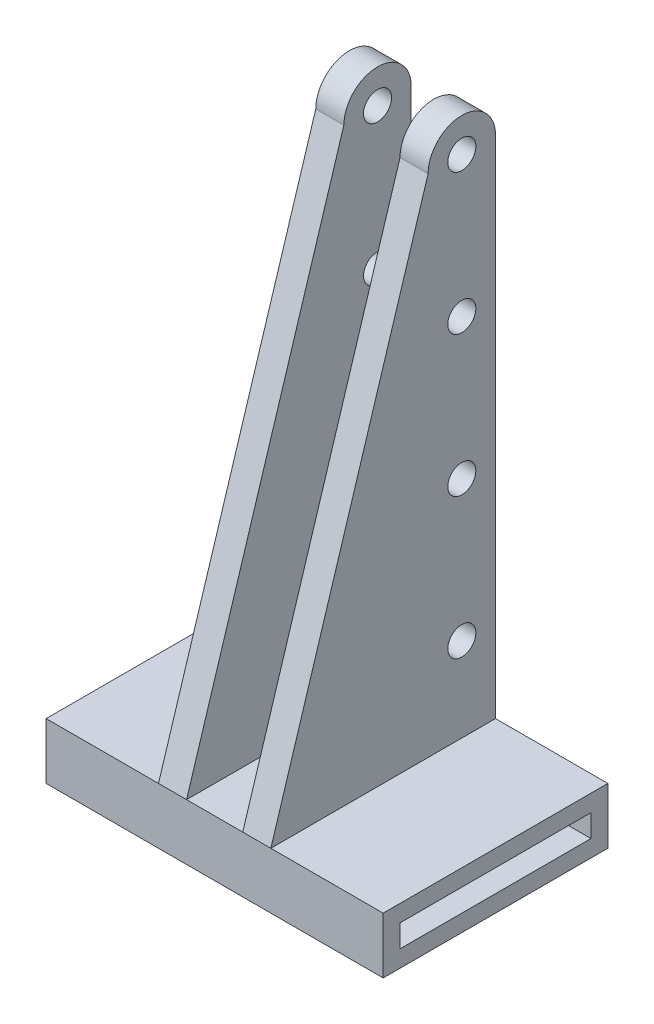
ISO-10303-21;
HEADER;
FILE_DESCRIPTION(('STEP AP214'),'2;1');
FILE_NAME('part.step','',(''),(''),'','','');
FILE_SCHEMA(('AUTOMOTIVE_DESIGN { 1 0 10303 214 1 1 1 1 }'));
ENDSEC;
DATA;
#1=APPLICATION_CONTEXT('core data for automotive mechanical design processes');
#2=APPLICATION_PROTOCOL_DEFINITION('international standard','automotive_design',2000,#1);
#3=PRODUCT_CONTEXT('',#1,'mechanical');
#4=PRODUCT('Part','Part','',(#3));
#5=PRODUCT_RELATED_PRODUCT_CATEGORY('part','',(#4));
#6=PRODUCT_DEFINITION_FORMATION('','',#4);
#7=PRODUCT_DEFINITION_CONTEXT('part definition',#1,'design');
#8=PRODUCT_DEFINITION('design','',#6,#7);
#9=PRODUCT_DEFINITION_SHAPE('','',#8);
#10=(LENGTH_UNIT() NAMED_UNIT(*) SI_UNIT(.MILLI.,.METRE.));
#11=(NAMED_UNIT(*) PLANE_ANGLE_UNIT() SI_UNIT($,.RADIAN.));
#12=(NAMED_UNIT(*) SI_UNIT($,.STERADIAN.) SOLID_ANGLE_UNIT());
#13=UNCERTAINTY_MEASURE_WITH_UNIT(LENGTH_MEASURE(1.E-05),#10,'distance_accuracy_value','');
#14=(GEOMETRIC_REPRESENTATION_CONTEXT(3) GLOBAL_UNCERTAINTY_ASSIGNED_CONTEXT((#13)) GLOBAL_UNIT_ASSIGNED_CONTEXT((#10,
#11,#12)) REPRESENTATION_CONTEXT('',''));
#15=CARTESIAN_POINT('',(0.,0.,0.));
#16=DIRECTION('',(0.,0.,1.));
#17=DIRECTION('',(1.,0.,0.));
#18=AXIS2_PLACEMENT_3D('',#15,#16,#17);
#19=CARTESIAN_POINT('',(0.,10.,0.));
#20=DIRECTION('',(0.,1.,0.));
#21=DIRECTION('',(0.,0.,1.));
#22=AXIS2_PLACEMENT_3D('',#19,#20,#21);
#23=PLANE('',#22);
#24=DIRECTION('',(1.,0.,0.));
#25=VECTOR('',#24,1.);
#26=CARTESIAN_POINT('',(-30.,10.,20.));
#27=LINE('',#26,#25);
#28=CARTESIAN_POINT('',(-30.,10.,20.));
#29=VERTEX_POINT('',#28);
#30=CARTESIAN_POINT('',(-10.,10.,20.));
#31=VERTEX_POINT('',#30);
#32=EDGE_CURVE('E362',#29,#31,#27,.T.);
#33=ORIENTED_EDGE('',*,*,#32,.T.);
#34=DIRECTION('',(0.,0.,1.));
#35=VECTOR('',#34,1.);
#36=CARTESIAN_POINT('',(-10.,10.,0.));
#37=LINE('',#36,#35);
#38=CARTESIAN_POINT('',(-10.,10.,-20.));
#39=VERTEX_POINT('',#38);
#40=EDGE_CURVE('E229',#39,#31,#37,.T.);
#41=ORIENTED_EDGE('',*,*,#40,.F.);
#42=DIRECTION('',(-1.,0.,0.));
#43=VECTOR('',#42,1.);
#44=CARTESIAN_POINT('',(-30.,10.,-20.));
#45=LINE('',#44,#43);
#46=CARTESIAN_POINT('',(-30.,10.,-20.));
#47=VERTEX_POINT('',#46);
#48=EDGE_CURVE('E351',#39,#47,#45,.T.);
#49=ORIENTED_EDGE('',*,*,#48,.T.);
#50=DIRECTION('',(0.,0.,1.));
#51=VECTOR('',#50,1.);
#52=CARTESIAN_POINT('',(-30.,10.,-20.));
#53=LINE('',#52,#51);
#54=EDGE_CURVE('E357',#47,#29,#53,.T.);
#55=ORIENTED_EDGE('',*,*,#54,.T.);
#56=EDGE_LOOP('',(#33,#41,#49,#55));
#57=FACE_BOUND('',#56,.T.);
#58=ADVANCED_FACE('F38',(#57),#23,.T.);
#59=CARTESIAN_POINT('',(30.,10.,-20.));
#60=VERTEX_POINT('',#59);
#61=CARTESIAN_POINT('',(10.,10.,-20.));
#62=VERTEX_POINT('',#61);
#63=EDGE_CURVE('E353',#60,#62,#45,.T.);
#64=ORIENTED_EDGE('',*,*,#63,.T.);
#65=DIRECTION('',(0.,0.,1.));
#66=VECTOR('',#65,1.);
#67=CARTESIAN_POINT('',(10.,10.,0.));
#68=LINE('',#67,#66);
#69=CARTESIAN_POINT('',(10.,10.,20.));
#70=VERTEX_POINT('',#69);
#71=EDGE_CURVE('E301',#62,#70,#68,.T.);
#72=ORIENTED_EDGE('',*,*,#71,.T.);
#73=CARTESIAN_POINT('',(30.,10.,20.));
#74=VERTEX_POINT('',#73);
#75=EDGE_CURVE('E361',#70,#74,#27,.T.);
#76=ORIENTED_EDGE('',*,*,#75,.T.);
#77=DIRECTION('',(0.,0.,-1.));
#78=VECTOR('',#77,1.);
#79=CARTESIAN_POINT('',(30.,10.,-20.));
#80=LINE('',#79,#78);
#81=EDGE_CURVE('E347',#74,#60,#80,.T.);
#82=ORIENTED_EDGE('',*,*,#81,.T.);
#83=EDGE_LOOP('',(#64,#72,#76,#82));
#84=FACE_BOUND('',#83,.T.);
#85=ADVANCED_FACE('F407',(#84),#23,.T.);
#86=CARTESIAN_POINT('',(30.,10.,-20.));
#87=DIRECTION('',(-1.,0.,0.));
#88=DIRECTION('',(0.,0.,1.));
#89=AXIS2_PLACEMENT_3D('',#86,#87,#88);
#90=PLANE('',#89);
#91=DIRECTION('',(0.,0.,-1.));
#92=VECTOR('',#91,1.);
#93=CARTESIAN_POINT('',(30.,7.,17.));
#94=LINE('',#93,#92);
#95=CARTESIAN_POINT('',(30.,7.,17.));
#96=VERTEX_POINT('',#95);
#97=CARTESIAN_POINT('',(30.,7.,-17.));
#98=VERTEX_POINT('',#97);
#99=EDGE_CURVE('E161',#96,#98,#94,.T.);
#100=ORIENTED_EDGE('',*,*,#99,.T.);
#101=DIRECTION('',(0.,-1.,0.));
#102=VECTOR('',#101,1.);
#103=CARTESIAN_POINT('',(30.,7.,-17.));
#104=LINE('',#103,#102);
#105=CARTESIAN_POINT('',(30.,3.,-17.));
#106=VERTEX_POINT('',#105);
#107=EDGE_CURVE('E154',#98,#106,#104,.T.);
#108=ORIENTED_EDGE('',*,*,#107,.T.);
#109=DIRECTION('',(0.,0.,1.));
#110=VECTOR('',#109,1.);
#111=CARTESIAN_POINT('',(30.,3.,-17.));
#112=LINE('',#111,#110);
#113=CARTESIAN_POINT('',(30.,3.,17.));
#114=VERTEX_POINT('',#113);
#115=EDGE_CURVE('E164',#106,#114,#112,.T.);
#116=ORIENTED_EDGE('',*,*,#115,.T.);
#117=DIRECTION('',(0.,1.,0.));
#118=VECTOR('',#117,1.);
#119=CARTESIAN_POINT('',(30.,3.,17.));
#120=LINE('',#119,#118);
#121=EDGE_CURVE('E54',#114,#96,#120,.T.);
#122=ORIENTED_EDGE('',*,*,#121,.T.);
#123=EDGE_LOOP('',(#100,#108,#116,#122));
#124=FACE_BOUND('',#123,.T.);
#125=DIRECTION('',(0.,0.,-1.));
#126=VECTOR('',#125,1.);
#127=CARTESIAN_POINT('',(30.,0.,-20.));
#128=LINE('',#127,#126);
#129=CARTESIAN_POINT('',(30.,0.,20.));
#130=VERTEX_POINT('',#129);
#131=CARTESIAN_POINT('',(30.,0.,-20.));
#132=VERTEX_POINT('',#131);
#133=EDGE_CURVE('E346',#130,#132,#128,.T.);
#134=ORIENTED_EDGE('',*,*,#133,.T.);
#135=DIRECTION('',(0.,-1.,0.));
#136=VECTOR('',#135,1.);
#137=CARTESIAN_POINT('',(30.,10.,-20.));
#138=LINE('',#137,#136);
#139=EDGE_CURVE('E11',#60,#132,#138,.T.);
#140=ORIENTED_EDGE('',*,*,#139,.F.);
#141=ORIENTED_EDGE('',*,*,#81,.F.);
#142=DIRECTION('',(0.,-1.,0.));
#143=VECTOR('',#142,1.);
#144=CARTESIAN_POINT('',(30.,10.,20.));
#145=LINE('',#144,#143);
#146=EDGE_CURVE('E366',#74,#130,#145,.T.);
#147=ORIENTED_EDGE('',*,*,#146,.T.);
#148=EDGE_LOOP('',(#134,#140,#141,#147));
#149=FACE_BOUND('',#148,.T.);
#150=ADVANCED_FACE('F40',(#124,#149),#90,.F.);
#151=CARTESIAN_POINT('',(-30.,10.,-20.));
#152=DIRECTION('',(0.,0.,1.));
#153=DIRECTION('',(1.,0.,0.));
#154=AXIS2_PLACEMENT_3D('',#151,#152,#153);
#155=PLANE('',#154);
#156=DIRECTION('',(-1.,0.,0.));
#157=VECTOR('',#156,1.);
#158=CARTESIAN_POINT('',(-30.,0.,-20.));
#159=LINE('',#158,#157);
#160=CARTESIAN_POINT('',(-30.,0.,-20.));
#161=VERTEX_POINT('',#160);
#162=EDGE_CURVE('E371',#132,#161,#159,.T.);
#163=ORIENTED_EDGE('',*,*,#162,.T.);
#164=DIRECTION('',(0.,-1.,0.));
#165=VECTOR('',#164,1.);
#166=CARTESIAN_POINT('',(-30.,10.,-20.));
#167=LINE('',#166,#165);
#168=EDGE_CURVE('E47',#47,#161,#167,.T.);
#169=ORIENTED_EDGE('',*,*,#168,.F.);
#170=ORIENTED_EDGE('',*,*,#48,.F.);
#171=DIRECTION('',(0.,1.,0.));
#172=VECTOR('',#171,1.);
#173=CARTESIAN_POINT('',(-10.,0.,-20.));
#174=LINE('',#173,#172);
#175=CARTESIAN_POINT('',(-10.,100.,-20.));
#176=VERTEX_POINT('',#175);
#177=EDGE_CURVE('E217',#39,#176,#174,.T.);
#178=ORIENTED_EDGE('',*,*,#177,.T.);
#179=DIRECTION('',(1.,0.,0.));
#180=VECTOR('',#179,1.);
#181=CARTESIAN_POINT('',(-10.,100.,-20.));
#182=LINE('',#181,#180);
#183=CARTESIAN_POINT('',(-5.,100.,-20.));
#184=VERTEX_POINT('',#183);
#185=EDGE_CURVE('E233',#176,#184,#182,.T.);
#186=ORIENTED_EDGE('',*,*,#185,.T.);
#187=DIRECTION('',(0.,1.,0.));
#188=VECTOR('',#187,1.);
#189=CARTESIAN_POINT('',(-5.,0.,-20.));
#190=LINE('',#189,#188);
#191=CARTESIAN_POINT('',(-5.,10.,-20.));
#192=VERTEX_POINT('',#191);
#193=EDGE_CURVE('E249',#192,#184,#190,.T.);
#194=ORIENTED_EDGE('',*,*,#193,.F.);
#195=CARTESIAN_POINT('',(5.,10.,-20.));
#196=VERTEX_POINT('',#195);
#197=EDGE_CURVE('E358',#196,#192,#45,.T.);
#198=ORIENTED_EDGE('',*,*,#197,.F.);
#199=DIRECTION('',(0.,1.,0.));
#200=VECTOR('',#199,1.);
#201=CARTESIAN_POINT('',(5.,0.,-20.));
#202=LINE('',#201,#200);
#203=CARTESIAN_POINT('',(5.,100.,-20.));
#204=VERTEX_POINT('',#203);
#205=EDGE_CURVE('E321',#196,#204,#202,.T.);
#206=ORIENTED_EDGE('',*,*,#205,.T.);
#207=DIRECTION('',(-1.,0.,0.));
#208=VECTOR('',#207,1.);
#209=CARTESIAN_POINT('',(10.,100.,-20.));
#210=LINE('',#209,#208);
#211=CARTESIAN_POINT('',(10.,100.,-20.));
#212=VERTEX_POINT('',#211);
#213=EDGE_CURVE('E342',#212,#204,#210,.T.);
#214=ORIENTED_EDGE('',*,*,#213,.F.);
#215=DIRECTION('',(0.,1.,0.));
#216=VECTOR('',#215,1.);
#217=CARTESIAN_POINT('',(10.,0.,-20.));
#218=LINE('',#217,#216);
#219=EDGE_CURVE('E290',#62,#212,#218,.T.);
#220=ORIENTED_EDGE('',*,*,#219,.F.);
#221=ORIENTED_EDGE('',*,*,#63,.F.);
#222=ORIENTED_EDGE('',*,*,#139,.T.);
#223=EDGE_LOOP('',(#163,#169,#170,#178,#186,#194,#198,#206,#214,#220,#221,#222));
#224=FACE_BOUND('',#223,.T.);
#225=ADVANCED_FACE('F425',(#224),#155,.F.);
#226=CARTESIAN_POINT('',(-30.,10.,-20.));
#227=DIRECTION('',(1.,0.,0.));
#228=DIRECTION('',(0.,0.,-1.));
#229=AXIS2_PLACEMENT_3D('',#226,#227,#228);
#230=PLANE('',#229);
#231=DIRECTION('',(0.,0.,1.));
#232=VECTOR('',#231,1.);
#233=CARTESIAN_POINT('',(-30.,3.,-17.));
#234=LINE('',#233,#232);
#235=CARTESIAN_POINT('',(-30.,3.,-17.));
#236=VERTEX_POINT('',#235);
#237=CARTESIAN_POINT('',(-30.,3.,17.));
#238=VERTEX_POINT('',#237);
#239=EDGE_CURVE('E185',#236,#238,#234,.T.);
#240=ORIENTED_EDGE('',*,*,#239,.F.);
#241=DIRECTION('',(0.,-1.,0.));
#242=VECTOR('',#241,1.);
#243=CARTESIAN_POINT('',(-30.,7.,-17.));
#244=LINE('',#243,#242);
#245=CARTESIAN_POINT('',(-30.,7.,-17.));
#246=VERTEX_POINT('',#245);
#247=EDGE_CURVE('E62',#246,#236,#244,.T.);
#248=ORIENTED_EDGE('',*,*,#247,.F.);
#249=DIRECTION('',(0.,0.,-1.));
#250=VECTOR('',#249,1.);
#251=CARTESIAN_POINT('',(-30.,7.,17.));
#252=LINE('',#251,#250);
#253=CARTESIAN_POINT('',(-30.,7.,17.));
#254=VERTEX_POINT('',#253);
#255=EDGE_CURVE('E172',#254,#246,#252,.T.);
#256=ORIENTED_EDGE('',*,*,#255,.F.);
#257=DIRECTION('',(0.,1.,0.));
#258=VECTOR('',#257,1.);
#259=CARTESIAN_POINT('',(-30.,3.,17.));
#260=LINE('',#259,#258);
#261=EDGE_CURVE('E176',#238,#254,#260,.T.);
#262=ORIENTED_EDGE('',*,*,#261,.F.);
#263=EDGE_LOOP('',(#240,#248,#256,#262));
#264=FACE_BOUND('',#263,.T.);
#265=DIRECTION('',(0.,0.,1.));
#266=VECTOR('',#265,1.);
#267=CARTESIAN_POINT('',(-30.,0.,-20.));
#268=LINE('',#267,#266);
#269=CARTESIAN_POINT('',(-30.,0.,20.));
#270=VERTEX_POINT('',#269);
#271=EDGE_CURVE('E374',#161,#270,#268,.T.);
#272=ORIENTED_EDGE('',*,*,#271,.T.);
#273=DIRECTION('',(0.,-1.,0.));
#274=VECTOR('',#273,1.);
#275=CARTESIAN_POINT('',(-30.,10.,20.));
#276=LINE('',#275,#274);
#277=EDGE_CURVE('E382',#29,#270,#276,.T.);
#278=ORIENTED_EDGE('',*,*,#277,.F.);
#279=ORIENTED_EDGE('',*,*,#54,.F.);
#280=ORIENTED_EDGE('',*,*,#168,.T.);
#281=EDGE_LOOP('',(#272,#278,#279,#280));
#282=FACE_BOUND('',#281,.T.);
#283=ADVANCED_FACE('F391',(#264,#282),#230,.F.);
#284=CARTESIAN_POINT('',(-30.,10.,20.));
#285=DIRECTION('',(0.,0.,-1.));
#286=DIRECTION('',(-1.,0.,0.));
#287=AXIS2_PLACEMENT_3D('',#284,#285,#286);
#288=PLANE('',#287);
#289=DIRECTION('',(1.,0.,0.));
#290=VECTOR('',#289,1.);
#291=CARTESIAN_POINT('',(-30.,0.,20.));
#292=LINE('',#291,#290);
#293=EDGE_CURVE('E352',#270,#130,#292,.T.);
#294=ORIENTED_EDGE('',*,*,#293,.T.);
#295=ORIENTED_EDGE('',*,*,#146,.F.);
#296=ORIENTED_EDGE('',*,*,#75,.F.);
#297=DIRECTION('',(-1.,0.,0.));
#298=VECTOR('',#297,1.);
#299=CARTESIAN_POINT('',(10.,10.,20.));
#300=LINE('',#299,#298);
#301=CARTESIAN_POINT('',(5.,10.,20.));
#302=VERTEX_POINT('',#301);
#303=EDGE_CURVE('E305',#70,#302,#300,.T.);
#304=ORIENTED_EDGE('',*,*,#303,.T.);
#305=CARTESIAN_POINT('',(-5.,10.,20.));
#306=VERTEX_POINT('',#305);
#307=EDGE_CURVE('E367',#306,#302,#27,.T.);
#308=ORIENTED_EDGE('',*,*,#307,.F.);
#309=DIRECTION('',(1.,0.,0.));
#310=VECTOR('',#309,1.);
#311=CARTESIAN_POINT('',(-10.,10.,20.));
#312=LINE('',#311,#310);
#313=EDGE_CURVE('E263',#31,#306,#312,.T.);
#314=ORIENTED_EDGE('',*,*,#313,.F.);
#315=ORIENTED_EDGE('',*,*,#32,.F.);
#316=ORIENTED_EDGE('',*,*,#277,.T.);
#317=EDGE_LOOP('',(#294,#295,#296,#304,#308,#314,#315,#316));
#318=FACE_BOUND('',#317,.T.);
#319=ADVANCED_FACE('F401',(#318),#288,.F.);
#320=DIRECTION('',(0.,0.,1.));
#321=VECTOR('',#320,1.);
#322=CARTESIAN_POINT('',(-5.,10.,0.));
#323=LINE('',#322,#321);
#324=EDGE_CURVE('E205',#192,#306,#323,.T.);
#325=ORIENTED_EDGE('',*,*,#324,.T.);
#326=ORIENTED_EDGE('',*,*,#307,.T.);
#327=DIRECTION('',(0.,0.,1.));
#328=VECTOR('',#327,1.);
#329=CARTESIAN_POINT('',(5.,10.,0.));
#330=LINE('',#329,#328);
#331=EDGE_CURVE('E278',#196,#302,#330,.T.);
#332=ORIENTED_EDGE('',*,*,#331,.F.);
#333=ORIENTED_EDGE('',*,*,#197,.T.);
#334=EDGE_LOOP('',(#325,#326,#332,#333));
#335=FACE_BOUND('',#334,.T.);
#336=ADVANCED_FACE('F414',(#335),#23,.T.);
#337=CARTESIAN_POINT('',(0.,0.,0.));
#338=DIRECTION('',(0.,1.,0.));
#339=DIRECTION('',(0.,0.,1.));
#340=AXIS2_PLACEMENT_3D('',#337,#338,#339);
#341=PLANE('',#340);
#342=ORIENTED_EDGE('',*,*,#133,.F.);
#343=ORIENTED_EDGE('',*,*,#293,.F.);
#344=ORIENTED_EDGE('',*,*,#271,.F.);
#345=ORIENTED_EDGE('',*,*,#162,.F.);
#346=EDGE_LOOP('',(#342,#343,#344,#345));
#347=FACE_BOUND('',#346,.T.);
#348=ADVANCED_FACE('F398',(#347),#341,.F.);
#349=CARTESIAN_POINT('',(10.,100.,-14.));
#350=DIRECTION('',(-1.,0.,0.));
#351=DIRECTION('',(0.,0.,1.));
#352=AXIS2_PLACEMENT_3D('',#349,#350,#351);
#353=CYLINDRICAL_SURFACE('',#352,6.);
#354=CARTESIAN_POINT('',(5.,100.,-14.));
#355=DIRECTION('',(1.,0.,0.));
#356=DIRECTION('',(0.,0.,-1.));
#357=AXIS2_PLACEMENT_3D('',#354,#355,#356);
#358=CIRCLE('',#357,6.);
#359=CARTESIAN_POINT('',(5.,100.,-8.));
#360=VERTEX_POINT('',#359);
#361=EDGE_CURVE('E325',#204,#360,#358,.T.);
#362=ORIENTED_EDGE('',*,*,#361,.T.);
#363=DIRECTION('',(-1.,0.,0.));
#364=VECTOR('',#363,1.);
#365=CARTESIAN_POINT('',(10.,100.,-8.));
#366=LINE('',#365,#364);
#367=CARTESIAN_POINT('',(10.,100.,-8.));
#368=VERTEX_POINT('',#367);
#369=EDGE_CURVE('E338',#368,#360,#366,.T.);
#370=ORIENTED_EDGE('',*,*,#369,.F.);
#371=CARTESIAN_POINT('',(10.,100.,-14.));
#372=DIRECTION('',(1.,0.,0.));
#373=DIRECTION('',(0.,0.,-1.));
#374=AXIS2_PLACEMENT_3D('',#371,#372,#373);
#375=CIRCLE('',#374,6.);
#376=EDGE_CURVE('E294',#212,#368,#375,.T.);
#377=ORIENTED_EDGE('',*,*,#376,.F.);
#378=ORIENTED_EDGE('',*,*,#213,.T.);
#379=EDGE_LOOP('',(#362,#370,#377,#378));
#380=FACE_BOUND('',#379,.T.);
#381=ADVANCED_FACE('F470',(#380),#353,.T.);
#382=CARTESIAN_POINT('',(10.,6.55560558307069,21.0715893741558));
#383=DIRECTION('',(0.,-0.297066552636244,-0.954856776330784));
#384=DIRECTION('',(0.,0.954856776330784,-0.297066552636244));
#385=AXIS2_PLACEMENT_3D('',#382,#383,#384);
#386=PLANE('',#385);
#387=DIRECTION('',(0.,-0.954856776330784,0.297066552636244));
#388=VECTOR('',#387,1.);
#389=CARTESIAN_POINT('',(5.,6.55560558307069,21.0715893741558));
#390=LINE('',#389,#388);
#391=EDGE_CURVE('E328',#360,#302,#390,.T.);
#392=ORIENTED_EDGE('',*,*,#391,.T.);
#393=ORIENTED_EDGE('',*,*,#303,.F.);
#394=DIRECTION('',(0.,-0.954856776330784,0.297066552636244));
#395=VECTOR('',#394,1.);
#396=CARTESIAN_POINT('',(10.,6.55560558307069,21.0715893741558));
#397=LINE('',#396,#395);
#398=EDGE_CURVE('E297',#368,#70,#397,.T.);
#399=ORIENTED_EDGE('',*,*,#398,.F.);
#400=ORIENTED_EDGE('',*,*,#369,.T.);
#401=EDGE_LOOP('',(#392,#393,#399,#400));
#402=FACE_BOUND('',#401,.T.);
#403=ADVANCED_FACE('F419',(#402),#386,.F.);
#404=CARTESIAN_POINT('',(10.,100.,-14.));
#405=DIRECTION('',(-1.,0.,0.));
#406=DIRECTION('',(0.,0.,1.));
#407=AXIS2_PLACEMENT_3D('',#404,#405,#406);
#408=CYLINDRICAL_SURFACE('',#407,2.5);
#409=CARTESIAN_POINT('',(10.,100.,-14.));
#410=DIRECTION('',(1.,0.,0.));
#411=DIRECTION('',(0.,0.,-1.));
#412=AXIS2_PLACEMENT_3D('',#409,#410,#411);
#413=CIRCLE('',#412,2.5);
#414=CARTESIAN_POINT('',(10.,100.,-16.5));
#415=VERTEX_POINT('',#414);
#416=EDGE_CURVE('E286',#415,#415,#413,.T.);
#417=ORIENTED_EDGE('',*,*,#416,.T.);
#418=EDGE_LOOP('',(#417));
#419=FACE_BOUND('',#418,.T.);
#420=CARTESIAN_POINT('',(5.,100.,-14.));
#421=DIRECTION('',(1.,0.,0.));
#422=DIRECTION('',(0.,0.,-1.));
#423=AXIS2_PLACEMENT_3D('',#420,#421,#422);
#424=CIRCLE('',#423,2.5);
#425=CARTESIAN_POINT('',(5.,100.,-16.5));
#426=VERTEX_POINT('',#425);
#427=EDGE_CURVE('E317',#426,#426,#424,.T.);
#428=ORIENTED_EDGE('',*,*,#427,.F.);
#429=EDGE_LOOP('',(#428));
#430=FACE_BOUND('',#429,.T.);
#431=ADVANCED_FACE('F564',(#419,#430),#408,.F.);
#432=CARTESIAN_POINT('',(10.,75.,-14.0000000000003));
#433=DIRECTION('',(-1.,0.,0.));
#434=DIRECTION('',(0.,0.,1.));
#435=AXIS2_PLACEMENT_3D('',#432,#433,#434);
#436=CYLINDRICAL_SURFACE('',#435,2.5);
#437=CARTESIAN_POINT('',(10.,75.,-14.0000000000003));
#438=DIRECTION('',(1.,0.,0.));
#439=DIRECTION('',(0.,0.,-1.));
#440=AXIS2_PLACEMENT_3D('',#437,#438,#439);
#441=CIRCLE('',#440,2.5);
#442=CARTESIAN_POINT('',(10.,75.,-16.5000000000003));
#443=VERTEX_POINT('',#442);
#444=EDGE_CURVE('E282',#443,#443,#441,.T.);
#445=ORIENTED_EDGE('',*,*,#444,.T.);
#446=EDGE_LOOP('',(#445));
#447=FACE_BOUND('',#446,.T.);
#448=CARTESIAN_POINT('',(5.,75.,-14.0000000000003));
#449=DIRECTION('',(1.,0.,0.));
#450=DIRECTION('',(0.,0.,-1.));
#451=AXIS2_PLACEMENT_3D('',#448,#449,#450);
#452=CIRCLE('',#451,2.5);
#453=CARTESIAN_POINT('',(5.,75.,-16.5000000000003));
#454=VERTEX_POINT('',#453);
#455=EDGE_CURVE('E313',#454,#454,#452,.T.);
#456=ORIENTED_EDGE('',*,*,#455,.F.);
#457=EDGE_LOOP('',(#456));
#458=FACE_BOUND('',#457,.T.);
#459=ADVANCED_FACE('F570',(#447,#458),#436,.F.);
#460=CARTESIAN_POINT('',(10.,50.,-14.0000000000005));
#461=DIRECTION('',(-1.,0.,0.));
#462=DIRECTION('',(0.,0.,1.));
#463=AXIS2_PLACEMENT_3D('',#460,#461,#462);
#464=CYLINDRICAL_SURFACE('',#463,2.5);
#465=CARTESIAN_POINT('',(10.,50.,-14.0000000000005));
#466=DIRECTION('',(1.,0.,0.));
#467=DIRECTION('',(0.,0.,-1.));
#468=AXIS2_PLACEMENT_3D('',#465,#466,#467);
#469=CIRCLE('',#468,2.5);
#470=CARTESIAN_POINT('',(10.,50.,-16.5000000000005));
#471=VERTEX_POINT('',#470);
#472=EDGE_CURVE('E277',#471,#471,#469,.T.);
#473=ORIENTED_EDGE('',*,*,#472,.T.);
#474=EDGE_LOOP('',(#473));
#475=FACE_BOUND('',#474,.T.);
#476=CARTESIAN_POINT('',(5.,50.,-14.0000000000005));
#477=DIRECTION('',(1.,0.,0.));
#478=DIRECTION('',(0.,0.,-1.));
#479=AXIS2_PLACEMENT_3D('',#476,#477,#478);
#480=CIRCLE('',#479,2.5);
#481=CARTESIAN_POINT('',(5.,50.,-16.5000000000005));
#482=VERTEX_POINT('',#481);
#483=EDGE_CURVE('E309',#482,#482,#480,.T.);
#484=ORIENTED_EDGE('',*,*,#483,.F.);
#485=EDGE_LOOP('',(#484));
#486=FACE_BOUND('',#485,.T.);
#487=ADVANCED_FACE('F574',(#475,#486),#464,.F.);
#488=CARTESIAN_POINT('',(10.,25.,-14.0000000000008));
#489=DIRECTION('',(-1.,0.,0.));
#490=DIRECTION('',(0.,0.,1.));
#491=AXIS2_PLACEMENT_3D('',#488,#489,#490);
#492=CYLINDRICAL_SURFACE('',#491,2.5);
#493=CARTESIAN_POINT('',(10.,25.,-14.0000000000008));
#494=DIRECTION('',(1.,0.,0.));
#495=DIRECTION('',(0.,0.,-1.));
#496=AXIS2_PLACEMENT_3D('',#493,#494,#495);
#497=CIRCLE('',#496,2.5);
#498=CARTESIAN_POINT('',(10.,25.,-16.5000000000008));
#499=VERTEX_POINT('',#498);
#500=EDGE_CURVE('E273',#499,#499,#497,.T.);
#501=ORIENTED_EDGE('',*,*,#500,.T.);
#502=EDGE_LOOP('',(#501));
#503=FACE_BOUND('',#502,.T.);
#504=CARTESIAN_POINT('',(5.,25.,-14.0000000000008));
#505=DIRECTION('',(1.,0.,0.));
#506=DIRECTION('',(0.,0.,-1.));
#507=AXIS2_PLACEMENT_3D('',#504,#505,#506);
#508=CIRCLE('',#507,2.5);
#509=CARTESIAN_POINT('',(5.,25.,-16.5000000000008));
#510=VERTEX_POINT('',#509);
#511=EDGE_CURVE('E267',#510,#510,#508,.T.);
#512=ORIENTED_EDGE('',*,*,#511,.F.);
#513=EDGE_LOOP('',(#512));
#514=FACE_BOUND('',#513,.T.);
#515=ADVANCED_FACE('F559',(#503,#514),#492,.F.);
#516=CARTESIAN_POINT('',(10.,0.,0.));
#517=DIRECTION('',(1.,0.,0.));
#518=DIRECTION('',(0.,0.,-1.));
#519=AXIS2_PLACEMENT_3D('',#516,#517,#518);
#520=PLANE('',#519);
#521=ORIENTED_EDGE('',*,*,#500,.F.);
#522=EDGE_LOOP('',(#521));
#523=FACE_BOUND('',#522,.T.);
#524=ORIENTED_EDGE('',*,*,#472,.F.);
#525=EDGE_LOOP('',(#524));
#526=FACE_BOUND('',#525,.T.);
#527=ORIENTED_EDGE('',*,*,#444,.F.);
#528=EDGE_LOOP('',(#527));
#529=FACE_BOUND('',#528,.T.);
#530=ORIENTED_EDGE('',*,*,#416,.F.);
#531=EDGE_LOOP('',(#530));
#532=FACE_BOUND('',#531,.T.);
#533=ORIENTED_EDGE('',*,*,#219,.T.);
#534=ORIENTED_EDGE('',*,*,#376,.T.);
#535=ORIENTED_EDGE('',*,*,#398,.T.);
#536=ORIENTED_EDGE('',*,*,#71,.F.);
#537=EDGE_LOOP('',(#533,#534,#535,#536));
#538=FACE_BOUND('',#537,.T.);
#539=ADVANCED_FACE('F453',(#523,#526,#529,#532,#538),#520,.T.);
#540=CARTESIAN_POINT('',(5.,0.,0.));
#541=DIRECTION('',(1.,0.,0.));
#542=DIRECTION('',(0.,0.,-1.));
#543=AXIS2_PLACEMENT_3D('',#540,#541,#542);
#544=PLANE('',#543);
#545=ORIENTED_EDGE('',*,*,#511,.T.);
#546=EDGE_LOOP('',(#545));
#547=FACE_BOUND('',#546,.T.);
#548=ORIENTED_EDGE('',*,*,#483,.T.);
#549=EDGE_LOOP('',(#548));
#550=FACE_BOUND('',#549,.T.);
#551=ORIENTED_EDGE('',*,*,#455,.T.);
#552=EDGE_LOOP('',(#551));
#553=FACE_BOUND('',#552,.T.);
#554=ORIENTED_EDGE('',*,*,#427,.T.);
#555=EDGE_LOOP('',(#554));
#556=FACE_BOUND('',#555,.T.);
#557=ORIENTED_EDGE('',*,*,#205,.F.);
#558=ORIENTED_EDGE('',*,*,#331,.T.);
#559=ORIENTED_EDGE('',*,*,#391,.F.);
#560=ORIENTED_EDGE('',*,*,#361,.F.);
#561=EDGE_LOOP('',(#557,#558,#559,#560));
#562=FACE_BOUND('',#561,.T.);
#563=ADVANCED_FACE('F423',(#547,#550,#553,#556,#562),#544,.F.);
#564=CARTESIAN_POINT('',(-10.,6.55560558307069,21.0715893741558));
#565=DIRECTION('',(0.,0.297066552636244,0.954856776330784));
#566=DIRECTION('',(0.,-0.954856776330784,0.297066552636244));
#567=AXIS2_PLACEMENT_3D('',#564,#565,#566);
#568=PLANE('',#567);
#569=DIRECTION('',(0.,-0.954856776330784,0.297066552636244));
#570=VECTOR('',#569,1.);
#571=CARTESIAN_POINT('',(-5.,6.55560558307069,21.0715893741558));
#572=LINE('',#571,#570);
#573=CARTESIAN_POINT('',(-5.,100.,-8.));
#574=VERTEX_POINT('',#573);
#575=EDGE_CURVE('E257',#574,#306,#572,.T.);
#576=ORIENTED_EDGE('',*,*,#575,.F.);
#577=DIRECTION('',(1.,0.,0.));
#578=VECTOR('',#577,1.);
#579=CARTESIAN_POINT('',(-10.,100.,-8.));
#580=LINE('',#579,#578);
#581=CARTESIAN_POINT('',(-10.,100.,-8.));
#582=VERTEX_POINT('',#581);
#583=EDGE_CURVE('E268',#582,#574,#580,.T.);
#584=ORIENTED_EDGE('',*,*,#583,.F.);
#585=DIRECTION('',(0.,-0.954856776330784,0.297066552636244));
#586=VECTOR('',#585,1.);
#587=CARTESIAN_POINT('',(-10.,6.55560558307069,21.0715893741558));
#588=LINE('',#587,#586);
#589=EDGE_CURVE('E225',#582,#31,#588,.T.);
#590=ORIENTED_EDGE('',*,*,#589,.T.);
#591=ORIENTED_EDGE('',*,*,#313,.T.);
#592=EDGE_LOOP('',(#576,#584,#590,#591));
#593=FACE_BOUND('',#592,.T.);
#594=ADVANCED_FACE('F442',(#593),#568,.T.);
#595=CARTESIAN_POINT('',(-10.,100.,-14.));
#596=DIRECTION('',(1.,0.,0.));
#597=DIRECTION('',(0.,0.,-1.));
#598=AXIS2_PLACEMENT_3D('',#595,#596,#597);
#599=CYLINDRICAL_SURFACE('',#598,2.5);
#600=CARTESIAN_POINT('',(-10.,100.,-14.));
#601=DIRECTION('',(1.,0.,0.));
#602=DIRECTION('',(0.,0.,-1.));
#603=AXIS2_PLACEMENT_3D('',#600,#601,#602);
#604=CIRCLE('',#603,2.5);
#605=CARTESIAN_POINT('',(-10.,100.,-16.5));
#606=VERTEX_POINT('',#605);
#607=EDGE_CURVE('E213',#606,#606,#604,.T.);
#608=ORIENTED_EDGE('',*,*,#607,.F.);
#609=EDGE_LOOP('',(#608));
#610=FACE_BOUND('',#609,.T.);
#611=CARTESIAN_POINT('',(-5.,100.,-14.));
#612=DIRECTION('',(1.,0.,0.));
#613=DIRECTION('',(0.,0.,-1.));
#614=AXIS2_PLACEMENT_3D('',#611,#612,#613);
#615=CIRCLE('',#614,2.5);
#616=CARTESIAN_POINT('',(-5.,100.,-16.5));
#617=VERTEX_POINT('',#616);
#618=EDGE_CURVE('E245',#617,#617,#615,.T.);
#619=ORIENTED_EDGE('',*,*,#618,.T.);
#620=EDGE_LOOP('',(#619));
#621=FACE_BOUND('',#620,.T.);
#622=ADVANCED_FACE('F444',(#610,#621),#599,.F.);
#623=CARTESIAN_POINT('',(-10.,75.,-14.0000000000003));
#624=DIRECTION('',(1.,0.,0.));
#625=DIRECTION('',(0.,0.,-1.));
#626=AXIS2_PLACEMENT_3D('',#623,#624,#625);
#627=CYLINDRICAL_SURFACE('',#626,2.5);
#628=CARTESIAN_POINT('',(-10.,75.,-14.0000000000003));
#629=DIRECTION('',(1.,0.,0.));
#630=DIRECTION('',(0.,0.,-1.));
#631=AXIS2_PLACEMENT_3D('',#628,#629,#630);
#632=CIRCLE('',#631,2.5);
#633=CARTESIAN_POINT('',(-10.,75.,-16.5000000000003));
#634=VERTEX_POINT('',#633);
#635=EDGE_CURVE('E209',#634,#634,#632,.T.);
#636=ORIENTED_EDGE('',*,*,#635,.F.);
#637=EDGE_LOOP('',(#636));
#638=FACE_BOUND('',#637,.T.);
#639=CARTESIAN_POINT('',(-5.,75.,-14.0000000000003));
#640=DIRECTION('',(1.,0.,0.));
#641=DIRECTION('',(0.,0.,-1.));
#642=AXIS2_PLACEMENT_3D('',#639,#640,#641);
#643=CIRCLE('',#642,2.5);
#644=CARTESIAN_POINT('',(-5.,75.,-16.5000000000003));
#645=VERTEX_POINT('',#644);
#646=EDGE_CURVE('E241',#645,#645,#643,.T.);
#647=ORIENTED_EDGE('',*,*,#646,.T.);
#648=EDGE_LOOP('',(#647));
#649=FACE_BOUND('',#648,.T.);
#650=ADVANCED_FACE('F450',(#638,#649),#627,.F.);
#651=CARTESIAN_POINT('',(-10.,50.,-14.0000000000005));
#652=DIRECTION('',(1.,0.,0.));
#653=DIRECTION('',(0.,0.,-1.));
#654=AXIS2_PLACEMENT_3D('',#651,#652,#653);
#655=CYLINDRICAL_SURFACE('',#654,2.5);
#656=CARTESIAN_POINT('',(-10.,50.,-14.0000000000005));
#657=DIRECTION('',(1.,0.,0.));
#658=DIRECTION('',(0.,0.,-1.));
#659=AXIS2_PLACEMENT_3D('',#656,#657,#658);
#660=CIRCLE('',#659,2.5);
#661=CARTESIAN_POINT('',(-10.,50.,-16.5000000000005));
#662=VERTEX_POINT('',#661);
#663=EDGE_CURVE('E204',#662,#662,#660,.T.);
#664=ORIENTED_EDGE('',*,*,#663,.F.);
#665=EDGE_LOOP('',(#664));
#666=FACE_BOUND('',#665,.T.);
#667=CARTESIAN_POINT('',(-5.,50.,-14.0000000000005));
#668=DIRECTION('',(1.,0.,0.));
#669=DIRECTION('',(0.,0.,-1.));
#670=AXIS2_PLACEMENT_3D('',#667,#668,#669);
#671=CIRCLE('',#670,2.5);
#672=CARTESIAN_POINT('',(-5.,50.,-16.5000000000005));
#673=VERTEX_POINT('',#672);
#674=EDGE_CURVE('E237',#673,#673,#671,.T.);
#675=ORIENTED_EDGE('',*,*,#674,.T.);
#676=EDGE_LOOP('',(#675));
#677=FACE_BOUND('',#676,.T.);
#678=ADVANCED_FACE('F544',(#666,#677),#655,.F.);
#679=CARTESIAN_POINT('',(-10.,25.,-14.0000000000008));
#680=DIRECTION('',(1.,0.,0.));
#681=DIRECTION('',(0.,0.,-1.));
#682=AXIS2_PLACEMENT_3D('',#679,#680,#681);
#683=CYLINDRICAL_SURFACE('',#682,2.5);
#684=CARTESIAN_POINT('',(-10.,25.,-14.0000000000008));
#685=DIRECTION('',(1.,0.,0.));
#686=DIRECTION('',(0.,0.,-1.));
#687=AXIS2_PLACEMENT_3D('',#684,#685,#686);
#688=CIRCLE('',#687,2.5);
#689=CARTESIAN_POINT('',(-10.,25.,-16.5000000000008));
#690=VERTEX_POINT('',#689);
#691=EDGE_CURVE('E200',#690,#690,#688,.T.);
#692=ORIENTED_EDGE('',*,*,#691,.F.);
#693=EDGE_LOOP('',(#692));
#694=FACE_BOUND('',#693,.T.);
#695=CARTESIAN_POINT('',(-5.,25.,-14.0000000000008));
#696=DIRECTION('',(1.,0.,0.));
#697=DIRECTION('',(0.,0.,-1.));
#698=AXIS2_PLACEMENT_3D('',#695,#696,#697);
#699=CIRCLE('',#698,2.5);
#700=CARTESIAN_POINT('',(-5.,25.,-16.5000000000008));
#701=VERTEX_POINT('',#700);
#702=EDGE_CURVE('E194',#701,#701,#699,.T.);
#703=ORIENTED_EDGE('',*,*,#702,.T.);
#704=EDGE_LOOP('',(#703));
#705=FACE_BOUND('',#704,.T.);
#706=ADVANCED_FACE('F550',(#694,#705),#683,.F.);
#707=CARTESIAN_POINT('',(-10.,100.,-14.));
#708=DIRECTION('',(1.,0.,0.));
#709=DIRECTION('',(0.,0.,-1.));
#710=AXIS2_PLACEMENT_3D('',#707,#708,#709);
#711=CYLINDRICAL_SURFACE('',#710,6.);
#712=CARTESIAN_POINT('',(-5.,100.,-14.));
#713=DIRECTION('',(1.,0.,0.));
#714=DIRECTION('',(0.,0.,-1.));
#715=AXIS2_PLACEMENT_3D('',#712,#713,#714);
#716=CIRCLE('',#715,6.);
#717=EDGE_CURVE('E253',#184,#574,#716,.T.);
#718=ORIENTED_EDGE('',*,*,#717,.F.);
#719=ORIENTED_EDGE('',*,*,#185,.F.);
#720=CARTESIAN_POINT('',(-10.,100.,-14.));
#721=DIRECTION('',(1.,0.,0.));
#722=DIRECTION('',(0.,0.,-1.));
#723=AXIS2_PLACEMENT_3D('',#720,#721,#722);
#724=CIRCLE('',#723,6.);
#725=EDGE_CURVE('E221',#176,#582,#724,.T.);
#726=ORIENTED_EDGE('',*,*,#725,.T.);
#727=ORIENTED_EDGE('',*,*,#583,.T.);
#728=EDGE_LOOP('',(#718,#719,#726,#727));
#729=FACE_BOUND('',#728,.T.);
#730=ADVANCED_FACE('F437',(#729),#711,.T.);
#731=CARTESIAN_POINT('',(-10.,0.,0.));
#732=DIRECTION('',(1.,0.,0.));
#733=DIRECTION('',(0.,0.,-1.));
#734=AXIS2_PLACEMENT_3D('',#731,#732,#733);
#735=PLANE('',#734);
#736=ORIENTED_EDGE('',*,*,#691,.T.);
#737=EDGE_LOOP('',(#736));
#738=FACE_BOUND('',#737,.T.);
#739=ORIENTED_EDGE('',*,*,#663,.T.);
#740=EDGE_LOOP('',(#739));
#741=FACE_BOUND('',#740,.T.);
#742=ORIENTED_EDGE('',*,*,#635,.T.);
#743=EDGE_LOOP('',(#742));
#744=FACE_BOUND('',#743,.T.);
#745=ORIENTED_EDGE('',*,*,#607,.T.);
#746=EDGE_LOOP('',(#745));
#747=FACE_BOUND('',#746,.T.);
#748=ORIENTED_EDGE('',*,*,#177,.F.);
#749=ORIENTED_EDGE('',*,*,#40,.T.);
#750=ORIENTED_EDGE('',*,*,#589,.F.);
#751=ORIENTED_EDGE('',*,*,#725,.F.);
#752=EDGE_LOOP('',(#748,#749,#750,#751));
#753=FACE_BOUND('',#752,.T.);
#754=ADVANCED_FACE('F433',(#738,#741,#744,#747,#753),#735,.F.);
#755=CARTESIAN_POINT('',(-5.,0.,0.));
#756=DIRECTION('',(1.,0.,0.));
#757=DIRECTION('',(0.,0.,-1.));
#758=AXIS2_PLACEMENT_3D('',#755,#756,#757);
#759=PLANE('',#758);
#760=ORIENTED_EDGE('',*,*,#702,.F.);
#761=EDGE_LOOP('',(#760));
#762=FACE_BOUND('',#761,.T.);
#763=ORIENTED_EDGE('',*,*,#674,.F.);
#764=EDGE_LOOP('',(#763));
#765=FACE_BOUND('',#764,.T.);
#766=ORIENTED_EDGE('',*,*,#646,.F.);
#767=EDGE_LOOP('',(#766));
#768=FACE_BOUND('',#767,.T.);
#769=ORIENTED_EDGE('',*,*,#618,.F.);
#770=EDGE_LOOP('',(#769));
#771=FACE_BOUND('',#770,.T.);
#772=ORIENTED_EDGE('',*,*,#193,.T.);
#773=ORIENTED_EDGE('',*,*,#717,.T.);
#774=ORIENTED_EDGE('',*,*,#575,.T.);
#775=ORIENTED_EDGE('',*,*,#324,.F.);
#776=EDGE_LOOP('',(#772,#773,#774,#775));
#777=FACE_BOUND('',#776,.T.);
#778=ADVANCED_FACE('F440',(#762,#765,#768,#771,#777),#759,.T.);
#779=CARTESIAN_POINT('',(30.,7.,-17.));
#780=DIRECTION('',(0.,0.,-1.));
#781=DIRECTION('',(-1.,0.,0.));
#782=AXIS2_PLACEMENT_3D('',#779,#780,#781);
#783=PLANE('',#782);
#784=ORIENTED_EDGE('',*,*,#247,.T.);
#785=DIRECTION('',(-1.,0.,0.));
#786=VECTOR('',#785,1.);
#787=CARTESIAN_POINT('',(30.,3.,-17.));
#788=LINE('',#787,#786);
#789=EDGE_CURVE('E150',#106,#236,#788,.T.);
#790=ORIENTED_EDGE('',*,*,#789,.F.);
#791=ORIENTED_EDGE('',*,*,#107,.F.);
#792=DIRECTION('',(-1.,0.,0.));
#793=VECTOR('',#792,1.);
#794=CARTESIAN_POINT('',(30.,7.,-17.));
#795=LINE('',#794,#793);
#796=EDGE_CURVE('E191',#98,#246,#795,.T.);
#797=ORIENTED_EDGE('',*,*,#796,.T.);
#798=EDGE_LOOP('',(#784,#790,#791,#797));
#799=FACE_BOUND('',#798,.T.);
#800=ADVANCED_FACE('F152',(#799),#783,.F.);
#801=CARTESIAN_POINT('',(30.,7.,17.));
#802=DIRECTION('',(0.,1.,0.));
#803=DIRECTION('',(0.,0.,1.));
#804=AXIS2_PLACEMENT_3D('',#801,#802,#803);
#805=PLANE('',#804);
#806=ORIENTED_EDGE('',*,*,#255,.T.);
#807=ORIENTED_EDGE('',*,*,#796,.F.);
#808=ORIENTED_EDGE('',*,*,#99,.F.);
#809=DIRECTION('',(-1.,0.,0.));
#810=VECTOR('',#809,1.);
#811=CARTESIAN_POINT('',(30.,7.,17.));
#812=LINE('',#811,#810);
#813=EDGE_CURVE('E195',#96,#254,#812,.T.);
#814=ORIENTED_EDGE('',*,*,#813,.T.);
#815=EDGE_LOOP('',(#806,#807,#808,#814));
#816=FACE_BOUND('',#815,.T.);
#817=ADVANCED_FACE('F499',(#816),#805,.F.);
#818=CARTESIAN_POINT('',(30.,3.,17.));
#819=DIRECTION('',(0.,0.,1.));
#820=DIRECTION('',(1.,0.,0.));
#821=AXIS2_PLACEMENT_3D('',#818,#819,#820);
#822=PLANE('',#821);
#823=ORIENTED_EDGE('',*,*,#261,.T.);
#824=ORIENTED_EDGE('',*,*,#813,.F.);
#825=ORIENTED_EDGE('',*,*,#121,.F.);
#826=DIRECTION('',(-1.,0.,0.));
#827=VECTOR('',#826,1.);
#828=CARTESIAN_POINT('',(30.,3.,17.));
#829=LINE('',#828,#827);
#830=EDGE_CURVE('E160',#114,#238,#829,.T.);
#831=ORIENTED_EDGE('',*,*,#830,.T.);
#832=EDGE_LOOP('',(#823,#824,#825,#831));
#833=FACE_BOUND('',#832,.T.);
#834=ADVANCED_FACE('F508',(#833),#822,.F.);
#835=CARTESIAN_POINT('',(30.,3.,-17.));
#836=DIRECTION('',(0.,-1.,0.));
#837=DIRECTION('',(0.,0.,-1.));
#838=AXIS2_PLACEMENT_3D('',#835,#836,#837);
#839=PLANE('',#838);
#840=ORIENTED_EDGE('',*,*,#239,.T.);
#841=ORIENTED_EDGE('',*,*,#830,.F.);
#842=ORIENTED_EDGE('',*,*,#115,.F.);
#843=ORIENTED_EDGE('',*,*,#789,.T.);
#844=EDGE_LOOP('',(#840,#841,#842,#843));
#845=FACE_BOUND('',#844,.T.);
#846=ADVANCED_FACE('F165',(#845),#839,.F.);
#847=CLOSED_SHELL('',(#58,#85,#150,#225,#283,#319,#336,#348,#381,#403,#431,#459,#487,#515,#539,
#563,#594,#622,#650,#678,#706,#730,#754,#778,#800,#817,#834,#846));
#848=MANIFOLD_SOLID_BREP('B2',#847);
#849=ADVANCED_BREP_SHAPE_REPRESENTATION('',(#18,#848),#14);
#850=SHAPE_DEFINITION_REPRESENTATION(#9,#849);
ENDSEC;
END-ISO-10303-21;
